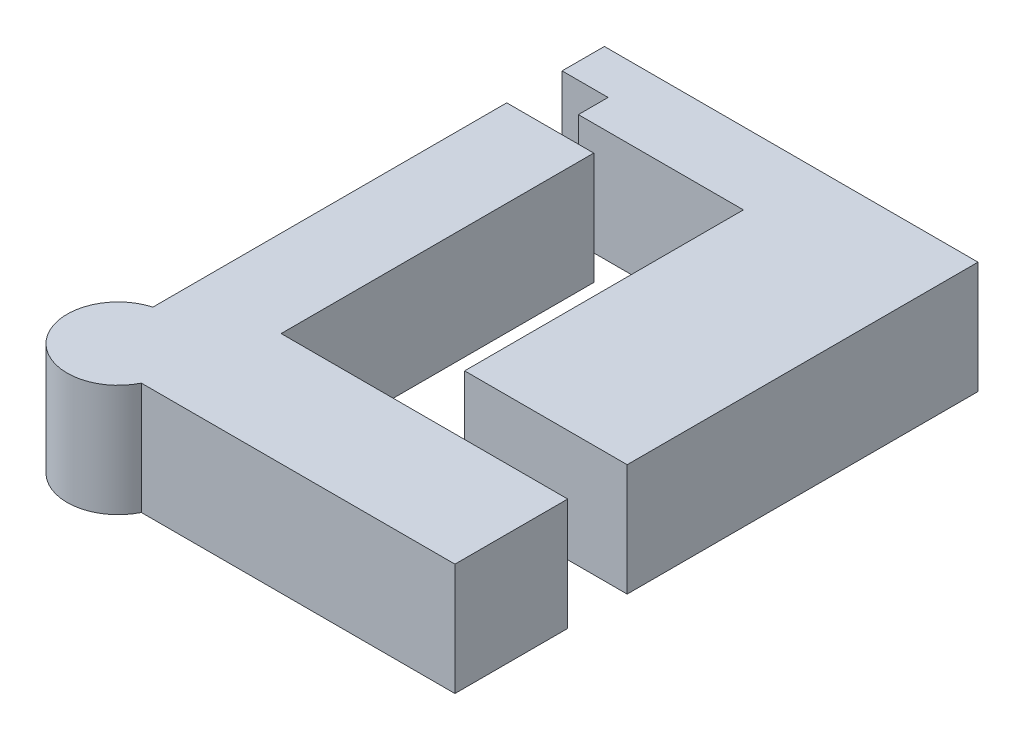
ISO-10303-21;
HEADER;
FILE_DESCRIPTION(('STEP AP214'),'2;1');
FILE_NAME('part.step','',(''),(''),'','','');
FILE_SCHEMA(('AUTOMOTIVE_DESIGN { 1 0 10303 214 1 1 1 1 }'));
ENDSEC;
DATA;
#1=APPLICATION_CONTEXT('core data for automotive mechanical design processes');
#2=APPLICATION_PROTOCOL_DEFINITION('international standard','automotive_design',2000,#1);
#3=PRODUCT_CONTEXT('',#1,'mechanical');
#4=PRODUCT('Part','Part','',(#3));
#5=PRODUCT_RELATED_PRODUCT_CATEGORY('part','',(#4));
#6=PRODUCT_DEFINITION_FORMATION('','',#4);
#7=PRODUCT_DEFINITION_CONTEXT('part definition',#1,'design');
#8=PRODUCT_DEFINITION('design','',#6,#7);
#9=PRODUCT_DEFINITION_SHAPE('','',#8);
#10=(LENGTH_UNIT() NAMED_UNIT(*) SI_UNIT(.MILLI.,.METRE.));
#11=(NAMED_UNIT(*) PLANE_ANGLE_UNIT() SI_UNIT($,.RADIAN.));
#12=(NAMED_UNIT(*) SI_UNIT($,.STERADIAN.) SOLID_ANGLE_UNIT());
#13=UNCERTAINTY_MEASURE_WITH_UNIT(LENGTH_MEASURE(1.E-05),#10,'distance_accuracy_value','');
#14=(GEOMETRIC_REPRESENTATION_CONTEXT(3) GLOBAL_UNCERTAINTY_ASSIGNED_CONTEXT((#13)) GLOBAL_UNIT_ASSIGNED_CONTEXT((#10,
#11,#12)) REPRESENTATION_CONTEXT('',''));
#15=CARTESIAN_POINT('',(0.,0.,0.));
#16=DIRECTION('',(0.,0.,1.));
#17=DIRECTION('',(1.,0.,0.));
#18=AXIS2_PLACEMENT_3D('',#15,#16,#17);
#19=CARTESIAN_POINT('',(9.76048881239244,30.,88.5735509810671));
#20=DIRECTION('',(-1.,0.,0.));
#21=DIRECTION('',(0.,0.,1.));
#22=AXIS2_PLACEMENT_3D('',#19,#20,#21);
#23=PLANE('',#22);
#24=DIRECTION('',(0.,0.,-1.));
#25=VECTOR('',#24,1.);
#26=CARTESIAN_POINT('',(9.76048881239244,0.,88.5735509810671));
#27=LINE('',#26,#25);
#28=CARTESIAN_POINT('',(9.76048881239244,0.,88.5735509810671));
#29=VERTEX_POINT('',#28);
#30=CARTESIAN_POINT('',(9.76048881239244,0.,58.3859107972207));
#31=VERTEX_POINT('',#30);
#32=EDGE_CURVE('E135',#29,#31,#27,.T.);
#33=ORIENTED_EDGE('',*,*,#32,.T.);
#34=DIRECTION('',(0.,-1.,0.));
#35=VECTOR('',#34,1.);
#36=CARTESIAN_POINT('',(9.76048881239244,30.,58.3859107972207));
#37=LINE('',#36,#35);
#38=CARTESIAN_POINT('',(9.76048881239244,30.,58.3859107972207));
#39=VERTEX_POINT('',#38);
#40=EDGE_CURVE('E12',#39,#31,#37,.T.);
#41=ORIENTED_EDGE('',*,*,#40,.F.);
#42=DIRECTION('',(0.,0.,-1.));
#43=VECTOR('',#42,1.);
#44=CARTESIAN_POINT('',(9.76048881239244,30.,88.5735509810671));
#45=LINE('',#44,#43);
#46=CARTESIAN_POINT('',(9.76048881239244,30.,88.5735509810671));
#47=VERTEX_POINT('',#46);
#48=EDGE_CURVE('E147',#47,#39,#45,.T.);
#49=ORIENTED_EDGE('',*,*,#48,.F.);
#50=DIRECTION('',(0.,-1.,0.));
#51=VECTOR('',#50,1.);
#52=CARTESIAN_POINT('',(9.76048881239244,30.,88.5735509810671));
#53=LINE('',#52,#51);
#54=EDGE_CURVE('E131',#47,#29,#53,.T.);
#55=ORIENTED_EDGE('',*,*,#54,.T.);
#56=EDGE_LOOP('',(#33,#41,#49,#55));
#57=FACE_BOUND('',#56,.T.);
#58=ADVANCED_FACE('F45',(#57),#23,.F.);
#59=CARTESIAN_POINT('',(-66.9470837459813,30.,58.3859107972207));
#60=DIRECTION('',(0.,0.,1.));
#61=DIRECTION('',(1.,0.,0.));
#62=AXIS2_PLACEMENT_3D('',#59,#60,#61);
#63=PLANE('',#62);
#64=DIRECTION('',(-1.,0.,0.));
#65=VECTOR('',#64,1.);
#66=CARTESIAN_POINT('',(-66.9470837459813,0.,58.3859107972207));
#67=LINE('',#66,#65);
#68=CARTESIAN_POINT('',(-66.9470837459813,0.,58.3859107972207));
#69=VERTEX_POINT('',#68);
#70=EDGE_CURVE('E138',#31,#69,#67,.T.);
#71=ORIENTED_EDGE('',*,*,#70,.T.);
#72=DIRECTION('',(0.,-1.,0.));
#73=VECTOR('',#72,1.);
#74=CARTESIAN_POINT('',(-66.9470837459813,30.,58.3859107972207));
#75=LINE('',#74,#73);
#76=CARTESIAN_POINT('',(-66.9470837459813,30.,58.3859107972207));
#77=VERTEX_POINT('',#76);
#78=EDGE_CURVE('E53',#77,#69,#75,.T.);
#79=ORIENTED_EDGE('',*,*,#78,.F.);
#80=DIRECTION('',(-1.,0.,0.));
#81=VECTOR('',#80,1.);
#82=CARTESIAN_POINT('',(-66.9470837459813,30.,58.3859107972207));
#83=LINE('',#82,#81);
#84=EDGE_CURVE('E101',#39,#77,#83,.T.);
#85=ORIENTED_EDGE('',*,*,#84,.F.);
#86=ORIENTED_EDGE('',*,*,#40,.T.);
#87=EDGE_LOOP('',(#71,#79,#85,#86));
#88=FACE_BOUND('',#87,.T.);
#89=ADVANCED_FACE('F172',(#88),#63,.F.);
#90=CARTESIAN_POINT('',(-66.9470837459813,30.,-25.2882234989091));
#91=DIRECTION('',(-1.,0.,0.));
#92=DIRECTION('',(0.,0.,1.));
#93=AXIS2_PLACEMENT_3D('',#90,#91,#92);
#94=PLANE('',#93);
#95=DIRECTION('',(0.,0.,-1.));
#96=VECTOR('',#95,1.);
#97=CARTESIAN_POINT('',(-66.9470837459813,0.,-25.2882234989091));
#98=LINE('',#97,#96);
#99=CARTESIAN_POINT('',(-66.9470837459813,0.,-25.2882234989091));
#100=VERTEX_POINT('',#99);
#101=EDGE_CURVE('E140',#69,#100,#98,.T.);
#102=ORIENTED_EDGE('',*,*,#101,.T.);
#103=DIRECTION('',(0.,-1.,0.));
#104=VECTOR('',#103,1.);
#105=CARTESIAN_POINT('',(-66.9470837459813,30.,-25.2882234989091));
#106=LINE('',#105,#104);
#107=CARTESIAN_POINT('',(-66.9470837459813,30.,-25.2882234989091));
#108=VERTEX_POINT('',#107);
#109=EDGE_CURVE('E151',#108,#100,#106,.T.);
#110=ORIENTED_EDGE('',*,*,#109,.F.);
#111=DIRECTION('',(0.,0.,-1.));
#112=VECTOR('',#111,1.);
#113=CARTESIAN_POINT('',(-66.9470837459813,30.,-25.2882234989091));
#114=LINE('',#113,#112);
#115=EDGE_CURVE('E159',#77,#108,#114,.T.);
#116=ORIENTED_EDGE('',*,*,#115,.F.);
#117=ORIENTED_EDGE('',*,*,#78,.T.);
#118=EDGE_LOOP('',(#102,#110,#116,#117));
#119=FACE_BOUND('',#118,.T.);
#120=ADVANCED_FACE('F157',(#119),#94,.F.);
#121=CARTESIAN_POINT('',(-90.2395111876076,30.,-25.2882234989091));
#122=DIRECTION('',(0.,0.,1.));
#123=DIRECTION('',(1.,0.,0.));
#124=AXIS2_PLACEMENT_3D('',#121,#122,#123);
#125=PLANE('',#124);
#126=DIRECTION('',(-1.,0.,0.));
#127=VECTOR('',#126,1.);
#128=CARTESIAN_POINT('',(-90.2395111876076,0.,-25.2882234989091));
#129=LINE('',#128,#127);
#130=CARTESIAN_POINT('',(-90.2395111876076,0.,-25.2882234989091));
#131=VERTEX_POINT('',#130);
#132=EDGE_CURVE('E142',#100,#131,#129,.T.);
#133=ORIENTED_EDGE('',*,*,#132,.T.);
#134=DIRECTION('',(0.,-1.,0.));
#135=VECTOR('',#134,1.);
#136=CARTESIAN_POINT('',(-90.2395111876076,30.,-25.2882234989091));
#137=LINE('',#136,#135);
#138=CARTESIAN_POINT('',(-90.2395111876076,30.,-25.2882234989091));
#139=VERTEX_POINT('',#138);
#140=EDGE_CURVE('E126',#139,#131,#137,.T.);
#141=ORIENTED_EDGE('',*,*,#140,.F.);
#142=DIRECTION('',(-1.,0.,0.));
#143=VECTOR('',#142,1.);
#144=CARTESIAN_POINT('',(-90.2395111876076,30.,-25.2882234989091));
#145=LINE('',#144,#143);
#146=EDGE_CURVE('E117',#108,#139,#145,.T.);
#147=ORIENTED_EDGE('',*,*,#146,.F.);
#148=ORIENTED_EDGE('',*,*,#109,.T.);
#149=EDGE_LOOP('',(#133,#141,#147,#148));
#150=FACE_BOUND('',#149,.T.);
#151=ADVANCED_FACE('F165',(#150),#125,.F.);
#152=CARTESIAN_POINT('',(-90.2395111876076,30.,-25.2882234989091));
#153=DIRECTION('',(1.,0.,0.));
#154=DIRECTION('',(0.,0.,-1.));
#155=AXIS2_PLACEMENT_3D('',#152,#153,#154);
#156=PLANE('',#155);
#157=DIRECTION('',(0.,0.,1.));
#158=VECTOR('',#157,1.);
#159=CARTESIAN_POINT('',(-90.2395111876076,0.,-25.2882234989091));
#160=LINE('',#159,#158);
#161=CARTESIAN_POINT('',(-90.2395111876076,0.,69.4033499431315));
#162=VERTEX_POINT('',#161);
#163=EDGE_CURVE('E125',#131,#162,#160,.T.);
#164=ORIENTED_EDGE('',*,*,#163,.T.);
#165=DIRECTION('',(0.,-1.,0.));
#166=VECTOR('',#165,1.);
#167=CARTESIAN_POINT('',(-90.2395111876076,30.,69.4033499431315));
#168=LINE('',#167,#166);
#169=CARTESIAN_POINT('',(-90.2395111876076,30.,69.4033499431315));
#170=VERTEX_POINT('',#169);
#171=EDGE_CURVE('E122',#170,#162,#168,.T.);
#172=ORIENTED_EDGE('',*,*,#171,.F.);
#173=DIRECTION('',(0.,0.,1.));
#174=VECTOR('',#173,1.);
#175=CARTESIAN_POINT('',(-90.2395111876076,30.,-25.2882234989091));
#176=LINE('',#175,#174);
#177=EDGE_CURVE('E111',#139,#170,#176,.T.);
#178=ORIENTED_EDGE('',*,*,#177,.F.);
#179=ORIENTED_EDGE('',*,*,#140,.T.);
#180=EDGE_LOOP('',(#164,#172,#178,#179));
#181=FACE_BOUND('',#180,.T.);
#182=ADVANCED_FACE('F123',(#181),#156,.F.);
#183=CARTESIAN_POINT('',(-86.4253248444247,30.,82.5279561023335));
#184=DIRECTION('',(0.,-1.,0.));
#185=DIRECTION('',(0.,0.,-1.));
#186=AXIS2_PLACEMENT_3D('',#183,#184,#185);
#187=CYLINDRICAL_SURFACE('',#186,13.6676005317205);
#188=CARTESIAN_POINT('',(-86.4253248444247,0.,82.5279561023335));
#189=DIRECTION('',(0.,1.,0.));
#190=DIRECTION('',(0.,0.,1.));
#191=AXIS2_PLACEMENT_3D('',#188,#189,#190);
#192=CIRCLE('',#191,13.6676005317205);
#193=CARTESIAN_POINT('',(-74.1675074670562,0.,88.5735509810671));
#194=VERTEX_POINT('',#193);
#195=EDGE_CURVE('E87',#162,#194,#192,.T.);
#196=ORIENTED_EDGE('',*,*,#195,.T.);
#197=DIRECTION('',(0.,-1.,0.));
#198=VECTOR('',#197,1.);
#199=CARTESIAN_POINT('',(-74.1675074670562,30.,88.5735509810671));
#200=LINE('',#199,#198);
#201=CARTESIAN_POINT('',(-74.1675074670562,30.,88.5735509810671));
#202=VERTEX_POINT('',#201);
#203=EDGE_CURVE('E127',#202,#194,#200,.T.);
#204=ORIENTED_EDGE('',*,*,#203,.F.);
#205=CARTESIAN_POINT('',(-86.4253248444247,30.,82.5279561023335));
#206=DIRECTION('',(0.,1.,0.));
#207=DIRECTION('',(0.,0.,1.));
#208=AXIS2_PLACEMENT_3D('',#205,#206,#207);
#209=CIRCLE('',#208,13.6676005317205);
#210=EDGE_CURVE('E115',#170,#202,#209,.T.);
#211=ORIENTED_EDGE('',*,*,#210,.F.);
#212=ORIENTED_EDGE('',*,*,#171,.T.);
#213=EDGE_LOOP('',(#196,#204,#211,#212));
#214=FACE_BOUND('',#213,.T.);
#215=ADVANCED_FACE('F129',(#214),#187,.T.);
#216=CARTESIAN_POINT('',(-74.1675074670562,30.,88.5735509810671));
#217=DIRECTION('',(0.,0.,-1.));
#218=DIRECTION('',(-1.,0.,0.));
#219=AXIS2_PLACEMENT_3D('',#216,#217,#218);
#220=PLANE('',#219);
#221=DIRECTION('',(1.,0.,0.));
#222=VECTOR('',#221,1.);
#223=CARTESIAN_POINT('',(-74.1675074670562,0.,88.5735509810671));
#224=LINE('',#223,#222);
#225=EDGE_CURVE('E93',#194,#29,#224,.T.);
#226=ORIENTED_EDGE('',*,*,#225,.T.);
#227=ORIENTED_EDGE('',*,*,#54,.F.);
#228=DIRECTION('',(1.,0.,0.));
#229=VECTOR('',#228,1.);
#230=CARTESIAN_POINT('',(-74.1675074670562,30.,88.5735509810671));
#231=LINE('',#230,#229);
#232=EDGE_CURVE('E61',#202,#47,#231,.T.);
#233=ORIENTED_EDGE('',*,*,#232,.F.);
#234=ORIENTED_EDGE('',*,*,#203,.T.);
#235=EDGE_LOOP('',(#226,#227,#233,#234));
#236=FACE_BOUND('',#235,.T.);
#237=ADVANCED_FACE('F186',(#236),#220,.F.);
#238=CARTESIAN_POINT('',(-86.4253248444247,30.,82.5279561023335));
#239=DIRECTION('',(0.,1.,0.));
#240=DIRECTION('',(0.,0.,1.));
#241=AXIS2_PLACEMENT_3D('',#238,#239,#240);
#242=PLANE('',#241);
#243=ORIENTED_EDGE('',*,*,#48,.T.);
#244=ORIENTED_EDGE('',*,*,#84,.T.);
#245=ORIENTED_EDGE('',*,*,#115,.T.);
#246=ORIENTED_EDGE('',*,*,#146,.T.);
#247=ORIENTED_EDGE('',*,*,#177,.T.);
#248=ORIENTED_EDGE('',*,*,#210,.T.);
#249=ORIENTED_EDGE('',*,*,#232,.T.);
#250=EDGE_LOOP('',(#243,#244,#245,#246,#247,#248,#249));
#251=FACE_BOUND('',#250,.T.);
#252=ADVANCED_FACE('F113',(#251),#242,.T.);
#253=CARTESIAN_POINT('',(-86.4253248444247,0.,82.5279561023335));
#254=DIRECTION('',(0.,1.,0.));
#255=DIRECTION('',(0.,0.,1.));
#256=AXIS2_PLACEMENT_3D('',#253,#254,#255);
#257=PLANE('',#256);
#258=ORIENTED_EDGE('',*,*,#32,.F.);
#259=ORIENTED_EDGE('',*,*,#225,.F.);
#260=ORIENTED_EDGE('',*,*,#195,.F.);
#261=ORIENTED_EDGE('',*,*,#163,.F.);
#262=ORIENTED_EDGE('',*,*,#132,.F.);
#263=ORIENTED_EDGE('',*,*,#101,.F.);
#264=ORIENTED_EDGE('',*,*,#70,.F.);
#265=EDGE_LOOP('',(#258,#259,#260,#261,#262,#263,#264));
#266=FACE_BOUND('',#265,.T.);
#267=ADVANCED_FACE('F163',(#266),#257,.F.);
#268=CLOSED_SHELL('',(#58,#89,#120,#151,#182,#215,#237,#252,#267));
#269=MANIFOLD_SOLID_BREP('B2',#268);
#270=CARTESIAN_POINT('',(-90.2395111876076,30.,-40.1026603906829));
#271=DIRECTION('',(1.,0.,0.));
#272=DIRECTION('',(0.,0.,-1.));
#273=AXIS2_PLACEMENT_3D('',#270,#271,#272);
#274=PLANE('',#273);
#275=DIRECTION('',(0.,0.,1.));
#276=VECTOR('',#275,1.);
#277=CARTESIAN_POINT('',(-90.2395111876076,0.,-40.1026603906829));
#278=LINE('',#277,#276);
#279=CARTESIAN_POINT('',(-90.2395111876076,0.,-51.4264490189329));
#280=VERTEX_POINT('',#279);
#281=CARTESIAN_POINT('',(-90.2395111876076,0.,-40.1026603906829));
#282=VERTEX_POINT('',#281);
#283=EDGE_CURVE('E343',#280,#282,#278,.T.);
#284=ORIENTED_EDGE('',*,*,#283,.T.);
#285=DIRECTION('',(0.,-1.,0.));
#286=VECTOR('',#285,1.);
#287=CARTESIAN_POINT('',(-90.2395111876076,30.,-40.1026603906829));
#288=LINE('',#287,#286);
#289=CARTESIAN_POINT('',(-90.2395111876076,30.,-40.1026603906829));
#290=VERTEX_POINT('',#289);
#291=EDGE_CURVE('E43',#290,#282,#288,.T.);
#292=ORIENTED_EDGE('',*,*,#291,.F.);
#293=DIRECTION('',(0.,0.,1.));
#294=VECTOR('',#293,1.);
#295=CARTESIAN_POINT('',(-90.2395111876076,30.,-40.1026603906829));
#296=LINE('',#295,#294);
#297=CARTESIAN_POINT('',(-90.2395111876076,30.,-51.4264490189329));
#298=VERTEX_POINT('',#297);
#299=EDGE_CURVE('E357',#298,#290,#296,.T.);
#300=ORIENTED_EDGE('',*,*,#299,.F.);
#301=DIRECTION('',(0.,-1.,0.));
#302=VECTOR('',#301,1.);
#303=CARTESIAN_POINT('',(-90.2395111876076,30.,-51.4264490189329));
#304=LINE('',#303,#302);
#305=EDGE_CURVE('E339',#298,#280,#304,.T.);
#306=ORIENTED_EDGE('',*,*,#305,.T.);
#307=EDGE_LOOP('',(#284,#292,#300,#306));
#308=FACE_BOUND('',#307,.T.);
#309=ADVANCED_FACE('F247',(#308),#274,.F.);
#310=CARTESIAN_POINT('',(-77.9207407028508,30.,-40.1026603906829));
#311=DIRECTION('',(0.,0.,-1.));
#312=DIRECTION('',(-1.,0.,0.));
#313=AXIS2_PLACEMENT_3D('',#310,#311,#312);
#314=PLANE('',#313);
#315=DIRECTION('',(1.,0.,0.));
#316=VECTOR('',#315,1.);
#317=CARTESIAN_POINT('',(-77.9207407028508,0.,-40.1026603906829));
#318=LINE('',#317,#316);
#319=CARTESIAN_POINT('',(-77.9207407028508,0.,-40.1026603906829));
#320=VERTEX_POINT('',#319);
#321=EDGE_CURVE('E346',#282,#320,#318,.T.);
#322=ORIENTED_EDGE('',*,*,#321,.T.);
#323=DIRECTION('',(0.,-1.,0.));
#324=VECTOR('',#323,1.);
#325=CARTESIAN_POINT('',(-77.9207407028508,30.,-40.1026603906829));
#326=LINE('',#325,#324);
#327=CARTESIAN_POINT('',(-77.9207407028508,30.,-40.1026603906829));
#328=VERTEX_POINT('',#327);
#329=EDGE_CURVE('E255',#328,#320,#326,.T.);
#330=ORIENTED_EDGE('',*,*,#329,.F.);
#331=DIRECTION('',(1.,0.,0.));
#332=VECTOR('',#331,1.);
#333=CARTESIAN_POINT('',(-77.9207407028508,30.,-40.1026603906829));
#334=LINE('',#333,#332);
#335=EDGE_CURVE('E306',#290,#328,#334,.T.);
#336=ORIENTED_EDGE('',*,*,#335,.F.);
#337=ORIENTED_EDGE('',*,*,#291,.T.);
#338=EDGE_LOOP('',(#322,#330,#336,#337));
#339=FACE_BOUND('',#338,.T.);
#340=ADVANCED_FACE('F392',(#339),#314,.F.);
#341=CARTESIAN_POINT('',(-77.9207407028508,30.,-32.1467590969525));
#342=DIRECTION('',(1.,0.,0.));
#343=DIRECTION('',(0.,0.,-1.));
#344=AXIS2_PLACEMENT_3D('',#341,#342,#343);
#345=PLANE('',#344);
#346=DIRECTION('',(0.,0.,1.));
#347=VECTOR('',#346,1.);
#348=CARTESIAN_POINT('',(-77.9207407028508,0.,-32.1467590969525));
#349=LINE('',#348,#347);
#350=CARTESIAN_POINT('',(-77.9207407028508,0.,-32.1467590969525));
#351=VERTEX_POINT('',#350);
#352=EDGE_CURVE('E348',#320,#351,#349,.T.);
#353=ORIENTED_EDGE('',*,*,#352,.T.);
#354=DIRECTION('',(0.,-1.,0.));
#355=VECTOR('',#354,1.);
#356=CARTESIAN_POINT('',(-77.9207407028508,30.,-32.1467590969525));
#357=LINE('',#356,#355);
#358=CARTESIAN_POINT('',(-77.9207407028508,30.,-32.1467590969525));
#359=VERTEX_POINT('',#358);
#360=EDGE_CURVE('E364',#359,#351,#357,.T.);
#361=ORIENTED_EDGE('',*,*,#360,.F.);
#362=DIRECTION('',(0.,0.,1.));
#363=VECTOR('',#362,1.);
#364=CARTESIAN_POINT('',(-77.9207407028508,30.,-32.1467590969525));
#365=LINE('',#364,#363);
#366=EDGE_CURVE('E372',#328,#359,#365,.T.);
#367=ORIENTED_EDGE('',*,*,#366,.F.);
#368=ORIENTED_EDGE('',*,*,#329,.T.);
#369=EDGE_LOOP('',(#353,#361,#367,#368));
#370=FACE_BOUND('',#369,.T.);
#371=ADVANCED_FACE('F370',(#370),#345,.F.);
#372=CARTESIAN_POINT('',(-33.7517714514511,30.,-32.1467590969525));
#373=DIRECTION('',(0.,0.,-1.));
#374=DIRECTION('',(-1.,0.,0.));
#375=AXIS2_PLACEMENT_3D('',#372,#373,#374);
#376=PLANE('',#375);
#377=DIRECTION('',(1.,0.,0.));
#378=VECTOR('',#377,1.);
#379=CARTESIAN_POINT('',(-33.7517714514511,0.,-32.1467590969525));
#380=LINE('',#379,#378);
#381=CARTESIAN_POINT('',(-33.7517714514511,0.,-32.1467590969525));
#382=VERTEX_POINT('',#381);
#383=EDGE_CURVE('E350',#351,#382,#380,.T.);
#384=ORIENTED_EDGE('',*,*,#383,.T.);
#385=DIRECTION('',(0.,-1.,0.));
#386=VECTOR('',#385,1.);
#387=CARTESIAN_POINT('',(-33.7517714514511,30.,-32.1467590969525));
#388=LINE('',#387,#386);
#389=CARTESIAN_POINT('',(-33.7517714514511,30.,-32.1467590969525));
#390=VERTEX_POINT('',#389);
#391=EDGE_CURVE('E361',#390,#382,#388,.T.);
#392=ORIENTED_EDGE('',*,*,#391,.F.);
#393=DIRECTION('',(1.,0.,0.));
#394=VECTOR('',#393,1.);
#395=CARTESIAN_POINT('',(-33.7517714514511,30.,-32.1467590969525));
#396=LINE('',#395,#394);
#397=EDGE_CURVE('E384',#359,#390,#396,.T.);
#398=ORIENTED_EDGE('',*,*,#397,.F.);
#399=ORIENTED_EDGE('',*,*,#360,.T.);
#400=EDGE_LOOP('',(#384,#392,#398,#399));
#401=FACE_BOUND('',#400,.T.);
#402=ADVANCED_FACE('F380',(#401),#376,.F.);
#403=CARTESIAN_POINT('',(-33.7517714514511,30.,42.4741082097599));
#404=DIRECTION('',(1.,0.,0.));
#405=DIRECTION('',(0.,0.,-1.));
#406=AXIS2_PLACEMENT_3D('',#403,#404,#405);
#407=PLANE('',#406);
#408=DIRECTION('',(0.,0.,1.));
#409=VECTOR('',#408,1.);
#410=CARTESIAN_POINT('',(-33.7517714514511,0.,42.4741082097599));
#411=LINE('',#410,#409);
#412=CARTESIAN_POINT('',(-33.7517714514511,0.,42.4741082097599));
#413=VERTEX_POINT('',#412);
#414=EDGE_CURVE('E352',#382,#413,#411,.T.);
#415=ORIENTED_EDGE('',*,*,#414,.T.);
#416=DIRECTION('',(0.,-1.,0.));
#417=VECTOR('',#416,1.);
#418=CARTESIAN_POINT('',(-33.7517714514511,30.,42.4741082097599));
#419=LINE('',#418,#417);
#420=CARTESIAN_POINT('',(-33.7517714514511,30.,42.4741082097599));
#421=VERTEX_POINT('',#420);
#422=EDGE_CURVE('E334',#421,#413,#419,.T.);
#423=ORIENTED_EDGE('',*,*,#422,.F.);
#424=DIRECTION('',(0.,0.,1.));
#425=VECTOR('',#424,1.);
#426=CARTESIAN_POINT('',(-33.7517714514511,30.,42.4741082097599));
#427=LINE('',#426,#425);
#428=EDGE_CURVE('E325',#390,#421,#427,.T.);
#429=ORIENTED_EDGE('',*,*,#428,.F.);
#430=ORIENTED_EDGE('',*,*,#391,.T.);
#431=EDGE_LOOP('',(#415,#423,#429,#430));
#432=FACE_BOUND('',#431,.T.);
#433=ADVANCED_FACE('F383',(#432),#407,.F.);
#434=CARTESIAN_POINT('',(9.76048881239243,30.,42.4741082097599));
#435=DIRECTION('',(0.,0.,-1.));
#436=DIRECTION('',(-1.,0.,0.));
#437=AXIS2_PLACEMENT_3D('',#434,#435,#436);
#438=PLANE('',#437);
#439=DIRECTION('',(1.,0.,0.));
#440=VECTOR('',#439,1.);
#441=CARTESIAN_POINT('',(9.76048881239243,0.,42.4741082097599));
#442=LINE('',#441,#440);
#443=CARTESIAN_POINT('',(9.76048881239243,0.,42.4741082097599));
#444=VERTEX_POINT('',#443);
#445=EDGE_CURVE('E333',#413,#444,#442,.T.);
#446=ORIENTED_EDGE('',*,*,#445,.T.);
#447=DIRECTION('',(0.,-1.,0.));
#448=VECTOR('',#447,1.);
#449=CARTESIAN_POINT('',(9.76048881239243,30.,42.4741082097599));
#450=LINE('',#449,#448);
#451=CARTESIAN_POINT('',(9.76048881239243,30.,42.4741082097599));
#452=VERTEX_POINT('',#451);
#453=EDGE_CURVE('E330',#452,#444,#450,.T.);
#454=ORIENTED_EDGE('',*,*,#453,.F.);
#455=DIRECTION('',(1.,0.,0.));
#456=VECTOR('',#455,1.);
#457=CARTESIAN_POINT('',(9.76048881239243,30.,42.4741082097599));
#458=LINE('',#457,#456);
#459=EDGE_CURVE('E319',#421,#452,#458,.T.);
#460=ORIENTED_EDGE('',*,*,#459,.F.);
#461=ORIENTED_EDGE('',*,*,#422,.T.);
#462=EDGE_LOOP('',(#446,#454,#460,#461));
#463=FACE_BOUND('',#462,.T.);
#464=ADVANCED_FACE('F331',(#463),#438,.F.);
#465=CARTESIAN_POINT('',(9.76048881239242,30.,-51.4264490189329));
#466=DIRECTION('',(-1.,0.,0.));
#467=DIRECTION('',(0.,0.,1.));
#468=AXIS2_PLACEMENT_3D('',#465,#466,#467);
#469=PLANE('',#468);
#470=DIRECTION('',(0.,0.,-1.));
#471=VECTOR('',#470,1.);
#472=CARTESIAN_POINT('',(9.76048881239242,0.,-51.4264490189329));
#473=LINE('',#472,#471);
#474=CARTESIAN_POINT('',(9.76048881239242,0.,-51.4264490189329));
#475=VERTEX_POINT('',#474);
#476=EDGE_CURVE('E292',#444,#475,#473,.T.);
#477=ORIENTED_EDGE('',*,*,#476,.T.);
#478=DIRECTION('',(0.,-1.,0.));
#479=VECTOR('',#478,1.);
#480=CARTESIAN_POINT('',(9.76048881239242,30.,-51.4264490189329));
#481=LINE('',#480,#479);
#482=CARTESIAN_POINT('',(9.76048881239242,30.,-51.4264490189329));
#483=VERTEX_POINT('',#482);
#484=EDGE_CURVE('E335',#483,#475,#481,.T.);
#485=ORIENTED_EDGE('',*,*,#484,.F.);
#486=DIRECTION('',(0.,0.,-1.));
#487=VECTOR('',#486,1.);
#488=CARTESIAN_POINT('',(9.76048881239242,30.,-51.4264490189329));
#489=LINE('',#488,#487);
#490=EDGE_CURVE('E323',#452,#483,#489,.T.);
#491=ORIENTED_EDGE('',*,*,#490,.F.);
#492=ORIENTED_EDGE('',*,*,#453,.T.);
#493=EDGE_LOOP('',(#477,#485,#491,#492));
#494=FACE_BOUND('',#493,.T.);
#495=ADVANCED_FACE('F337',(#494),#469,.F.);
#496=CARTESIAN_POINT('',(-90.2395111876076,30.,-51.4264490189329));
#497=DIRECTION('',(0.,0.,1.));
#498=DIRECTION('',(1.,0.,0.));
#499=AXIS2_PLACEMENT_3D('',#496,#497,#498);
#500=PLANE('',#499);
#501=DIRECTION('',(-1.,0.,0.));
#502=VECTOR('',#501,1.);
#503=CARTESIAN_POINT('',(-90.2395111876076,0.,-51.4264490189329));
#504=LINE('',#503,#502);
#505=EDGE_CURVE('E298',#475,#280,#504,.T.);
#506=ORIENTED_EDGE('',*,*,#505,.T.);
#507=ORIENTED_EDGE('',*,*,#305,.F.);
#508=DIRECTION('',(-1.,0.,0.));
#509=VECTOR('',#508,1.);
#510=CARTESIAN_POINT('',(-90.2395111876076,30.,-51.4264490189329));
#511=LINE('',#510,#509);
#512=EDGE_CURVE('E263',#483,#298,#511,.T.);
#513=ORIENTED_EDGE('',*,*,#512,.F.);
#514=ORIENTED_EDGE('',*,*,#484,.T.);
#515=EDGE_LOOP('',(#506,#507,#513,#514));
#516=FACE_BOUND('',#515,.T.);
#517=ADVANCED_FACE('F408',(#516),#500,.F.);
#518=CARTESIAN_POINT('',(0.,30.,0.));
#519=DIRECTION('',(0.,-1.,0.));
#520=DIRECTION('',(0.,0.,-1.));
#521=AXIS2_PLACEMENT_3D('',#518,#519,#520);
#522=PLANE('',#521);
#523=ORIENTED_EDGE('',*,*,#299,.T.);
#524=ORIENTED_EDGE('',*,*,#335,.T.);
#525=ORIENTED_EDGE('',*,*,#366,.T.);
#526=ORIENTED_EDGE('',*,*,#397,.T.);
#527=ORIENTED_EDGE('',*,*,#428,.T.);
#528=ORIENTED_EDGE('',*,*,#459,.T.);
#529=ORIENTED_EDGE('',*,*,#490,.T.);
#530=ORIENTED_EDGE('',*,*,#512,.T.);
#531=EDGE_LOOP('',(#523,#524,#525,#526,#527,#528,#529,#530));
#532=FACE_BOUND('',#531,.T.);
#533=ADVANCED_FACE('F321',(#532),#522,.F.);
#534=CARTESIAN_POINT('',(0.,0.,0.));
#535=DIRECTION('',(0.,-1.,0.));
#536=DIRECTION('',(0.,0.,-1.));
#537=AXIS2_PLACEMENT_3D('',#534,#535,#536);
#538=PLANE('',#537);
#539=ORIENTED_EDGE('',*,*,#283,.F.);
#540=ORIENTED_EDGE('',*,*,#505,.F.);
#541=ORIENTED_EDGE('',*,*,#476,.F.);
#542=ORIENTED_EDGE('',*,*,#445,.F.);
#543=ORIENTED_EDGE('',*,*,#414,.F.);
#544=ORIENTED_EDGE('',*,*,#383,.F.);
#545=ORIENTED_EDGE('',*,*,#352,.F.);
#546=ORIENTED_EDGE('',*,*,#321,.F.);
#547=EDGE_LOOP('',(#539,#540,#541,#542,#543,#544,#545,#546));
#548=FACE_BOUND('',#547,.T.);
#549=ADVANCED_FACE('F376',(#548),#538,.T.);
#550=CLOSED_SHELL('',(#309,#340,#371,#402,#433,#464,#495,#517,#533,#549));
#551=MANIFOLD_SOLID_BREP('B6',#550);
#552=ADVANCED_BREP_SHAPE_REPRESENTATION('',(#18,#269,#551),#14);
#553=SHAPE_DEFINITION_REPRESENTATION(#9,#552);
ENDSEC;
END-ISO-10303-21;
